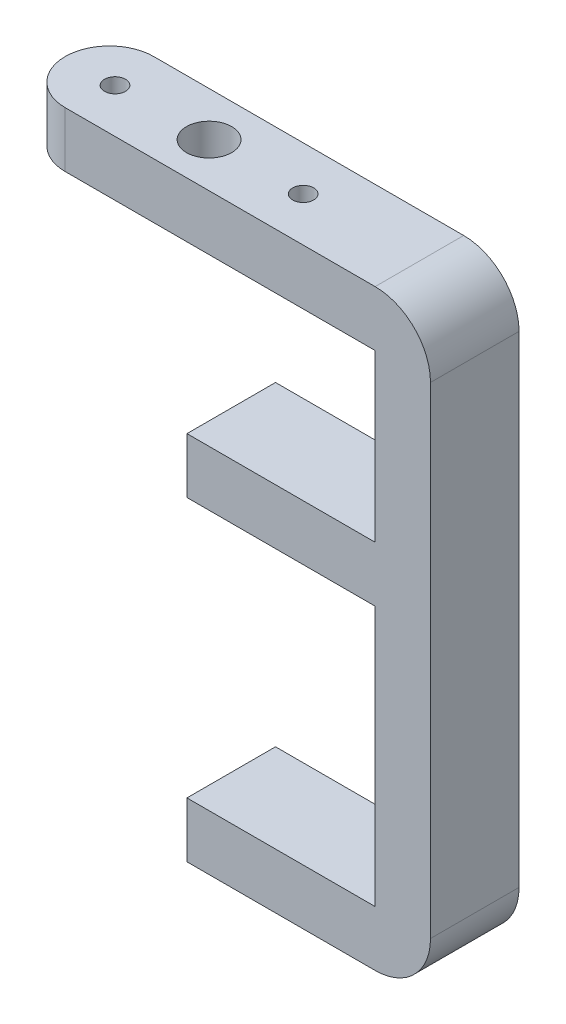
ISO-10303-21;
HEADER;
FILE_DESCRIPTION(('STEP AP214'),'2;1');
FILE_NAME('part.step','',(''),(''),'','','');
FILE_SCHEMA(('AUTOMOTIVE_DESIGN { 1 0 10303 214 1 1 1 1 }'));
ENDSEC;
DATA;
#1=APPLICATION_CONTEXT('core data for automotive mechanical design processes');
#2=APPLICATION_PROTOCOL_DEFINITION('international standard','automotive_design',2000,#1);
#3=PRODUCT_CONTEXT('',#1,'mechanical');
#4=PRODUCT('Part','Part','',(#3));
#5=PRODUCT_RELATED_PRODUCT_CATEGORY('part','',(#4));
#6=PRODUCT_DEFINITION_FORMATION('','',#4);
#7=PRODUCT_DEFINITION_CONTEXT('part definition',#1,'design');
#8=PRODUCT_DEFINITION('design','',#6,#7);
#9=PRODUCT_DEFINITION_SHAPE('','',#8);
#10=(LENGTH_UNIT() NAMED_UNIT(*) SI_UNIT(.MILLI.,.METRE.));
#11=(NAMED_UNIT(*) PLANE_ANGLE_UNIT() SI_UNIT($,.RADIAN.));
#12=(NAMED_UNIT(*) SI_UNIT($,.STERADIAN.) SOLID_ANGLE_UNIT());
#13=UNCERTAINTY_MEASURE_WITH_UNIT(LENGTH_MEASURE(1.E-05),#10,'distance_accuracy_value','');
#14=(GEOMETRIC_REPRESENTATION_CONTEXT(3) GLOBAL_UNCERTAINTY_ASSIGNED_CONTEXT((#13)) GLOBAL_UNIT_ASSIGNED_CONTEXT((#10,
#11,#12)) REPRESENTATION_CONTEXT('',''));
#15=CARTESIAN_POINT('',(0.,0.,0.));
#16=DIRECTION('',(0.,0.,1.));
#17=DIRECTION('',(1.,0.,0.));
#18=AXIS2_PLACEMENT_3D('',#15,#16,#17);
#19=CARTESIAN_POINT('',(53.1915910190782,212.276183768311,-32.0000067636297));
#20=DIRECTION('',(1.,0.,0.));
#21=DIRECTION('',(0.,1.,0.));
#22=AXIS2_PLACEMENT_3D('',#19,#20,#21);
#23=PLANE('',#22);
#24=DIRECTION('',(0.,0.,1.));
#25=VECTOR('',#24,1.);
#26=CARTESIAN_POINT('',(53.1915910190782,172.276183768311,31.9999932363703));
#27=LINE('',#26,#25);
#28=CARTESIAN_POINT('',(53.1915910190782,172.276183768311,-32.0000067636297));
#29=VERTEX_POINT('',#28);
#30=CARTESIAN_POINT('',(53.1915910190782,172.276183768311,31.9999932363703));
#31=VERTEX_POINT('',#30);
#32=EDGE_CURVE('E155',#29,#31,#27,.T.);
#33=ORIENTED_EDGE('',*,*,#32,.F.);
#34=DIRECTION('',(0.,-1.,0.));
#35=VECTOR('',#34,1.);
#36=CARTESIAN_POINT('',(53.1915910190782,212.276183768311,-32.0000067636297));
#37=LINE('',#36,#35);
#38=CARTESIAN_POINT('',(53.1915910190782,52.2761837683105,-32.0000067636297));
#39=VERTEX_POINT('',#38);
#40=EDGE_CURVE('E169',#29,#39,#37,.T.);
#41=ORIENTED_EDGE('',*,*,#40,.T.);
#42=DIRECTION('',(0.,0.,1.));
#43=VECTOR('',#42,1.);
#44=CARTESIAN_POINT('',(53.1915910190782,52.2761837683105,-32.0000067636297));
#45=LINE('',#44,#43);
#46=CARTESIAN_POINT('',(53.1915910190782,52.2761837683105,31.9999932363703));
#47=VERTEX_POINT('',#46);
#48=EDGE_CURVE('E164',#39,#47,#45,.T.);
#49=ORIENTED_EDGE('',*,*,#48,.T.);
#50=DIRECTION('',(0.,-1.,0.));
#51=VECTOR('',#50,1.);
#52=CARTESIAN_POINT('',(53.1915910190782,212.276183768311,31.9999932363703));
#53=LINE('',#52,#51);
#54=EDGE_CURVE('E171',#31,#47,#53,.T.);
#55=ORIENTED_EDGE('',*,*,#54,.F.);
#56=EDGE_LOOP('',(#33,#41,#49,#55));
#57=FACE_BOUND('',#56,.T.);
#58=ADVANCED_FACE('F45',(#57),#23,.F.);
#59=CARTESIAN_POINT('',(-82.8084089809218,52.2761837683105,31.9999932363703));
#60=DIRECTION('',(0.,-1.,0.));
#61=DIRECTION('',(0.,0.,-1.));
#62=AXIS2_PLACEMENT_3D('',#59,#60,#61);
#63=PLANE('',#62);
#64=ORIENTED_EDGE('',*,*,#48,.F.);
#65=DIRECTION('',(-1.,0.,0.));
#66=VECTOR('',#65,1.);
#67=CARTESIAN_POINT('',(-82.8084089809218,52.2761837683105,-32.0000067636297));
#68=LINE('',#67,#66);
#69=CARTESIAN_POINT('',(-82.8084089809218,52.2761837683105,-32.0000067636297));
#70=VERTEX_POINT('',#69);
#71=EDGE_CURVE('E178',#39,#70,#68,.T.);
#72=ORIENTED_EDGE('',*,*,#71,.T.);
#73=DIRECTION('',(0.,0.,-1.));
#74=VECTOR('',#73,1.);
#75=CARTESIAN_POINT('',(-82.8084089809218,52.2761837683105,31.9999932363703));
#76=LINE('',#75,#74);
#77=CARTESIAN_POINT('',(-82.8084089809218,52.2761837683105,31.9999932363703));
#78=VERTEX_POINT('',#77);
#79=EDGE_CURVE('E252',#78,#70,#76,.T.);
#80=ORIENTED_EDGE('',*,*,#79,.F.);
#81=DIRECTION('',(-1.,0.,0.));
#82=VECTOR('',#81,1.);
#83=CARTESIAN_POINT('',(-82.8084089809218,52.2761837683105,31.9999932363703));
#84=LINE('',#83,#82);
#85=EDGE_CURVE('E200',#47,#78,#84,.T.);
#86=ORIENTED_EDGE('',*,*,#85,.F.);
#87=EDGE_LOOP('',(#64,#72,#80,#86));
#88=FACE_BOUND('',#87,.T.);
#89=ADVANCED_FACE('F306',(#88),#63,.F.);
#90=CARTESIAN_POINT('',(-82.8084089809218,-215.723816231689,31.9999932363703));
#91=DIRECTION('',(1.,0.,0.));
#92=DIRECTION('',(0.,0.,-1.));
#93=AXIS2_PLACEMENT_3D('',#90,#91,#92);
#94=PLANE('',#93);
#95=CARTESIAN_POINT('',(-82.8084089809218,-190.874116647392,-0.000475230144837582));
#96=DIRECTION('',(-1.,0.,0.));
#97=DIRECTION('',(0.,0.,1.));
#98=AXIS2_PLACEMENT_3D('',#95,#96,#97);
#99=CIRCLE('',#98,9.6);
#100=CARTESIAN_POINT('',(-82.8084089809218,-190.874116647392,9.59952476985516));
#101=VERTEX_POINT('',#100);
#102=EDGE_CURVE('E381',#101,#101,#99,.T.);
#103=ORIENTED_EDGE('',*,*,#102,.F.);
#104=EDGE_LOOP('',(#103));
#105=FACE_BOUND('',#104,.T.);
#106=DIRECTION('',(0.,-1.,0.));
#107=VECTOR('',#106,1.);
#108=CARTESIAN_POINT('',(-82.8084089809218,-215.723816231689,-32.0000067636297));
#109=LINE('',#108,#107);
#110=CARTESIAN_POINT('',(-82.8084089809218,-175.723816231689,-32.0000067636297));
#111=VERTEX_POINT('',#110);
#112=CARTESIAN_POINT('',(-82.8084089809218,-215.723816231689,-32.0000067636297));
#113=VERTEX_POINT('',#112);
#114=EDGE_CURVE('E180',#111,#113,#109,.T.);
#115=ORIENTED_EDGE('',*,*,#114,.T.);
#116=DIRECTION('',(0.,0.,-1.));
#117=VECTOR('',#116,1.);
#118=CARTESIAN_POINT('',(-82.8084089809218,-215.723816231689,31.9999932363703));
#119=LINE('',#118,#117);
#120=CARTESIAN_POINT('',(-82.8084089809218,-215.723816231689,31.9999932363703));
#121=VERTEX_POINT('',#120);
#122=EDGE_CURVE('E247',#121,#113,#119,.T.);
#123=ORIENTED_EDGE('',*,*,#122,.F.);
#124=DIRECTION('',(0.,-1.,0.));
#125=VECTOR('',#124,1.);
#126=CARTESIAN_POINT('',(-82.8084089809218,-215.723816231689,31.9999932363703));
#127=LINE('',#126,#125);
#128=CARTESIAN_POINT('',(-82.8084089809218,-175.723816231689,31.9999932363703));
#129=VERTEX_POINT('',#128);
#130=EDGE_CURVE('E207',#129,#121,#127,.T.);
#131=ORIENTED_EDGE('',*,*,#130,.F.);
#132=DIRECTION('',(0.,0.,-1.));
#133=VECTOR('',#132,1.);
#134=CARTESIAN_POINT('',(-82.8084089809218,-175.723816231689,31.9999932363703));
#135=LINE('',#134,#133);
#136=EDGE_CURVE('E232',#129,#111,#135,.T.);
#137=ORIENTED_EDGE('',*,*,#136,.T.);
#138=EDGE_LOOP('',(#115,#123,#131,#137));
#139=FACE_BOUND('',#138,.T.);
#140=ADVANCED_FACE('F308',(#105,#139),#94,.F.);
#141=CARTESIAN_POINT('',(93.1915910190783,-215.723816231689,31.9999932363703));
#142=DIRECTION('',(0.,1.,0.));
#143=DIRECTION('',(-1.,0.,0.));
#144=AXIS2_PLACEMENT_3D('',#141,#142,#143);
#145=PLANE('',#144);
#146=DIRECTION('',(1.,0.,0.));
#147=VECTOR('',#146,1.);
#148=CARTESIAN_POINT('',(93.1915910190783,-215.723816231689,-32.0000067636297));
#149=LINE('',#148,#147);
#150=CARTESIAN_POINT('',(53.1915910190783,-215.723816231689,-32.0000067636297));
#151=VERTEX_POINT('',#150);
#152=EDGE_CURVE('E185',#113,#151,#149,.T.);
#153=ORIENTED_EDGE('',*,*,#152,.T.);
#154=DIRECTION('',(0.,0.,-1.));
#155=VECTOR('',#154,1.);
#156=CARTESIAN_POINT('',(53.1915910190783,-215.723816231689,31.9999932363703));
#157=LINE('',#156,#155);
#158=CARTESIAN_POINT('',(53.1915910190783,-215.723816231689,31.9999932363703));
#159=VERTEX_POINT('',#158);
#160=EDGE_CURVE('E630',#151,#159,#157,.F.);
#161=ORIENTED_EDGE('',*,*,#160,.T.);
#162=DIRECTION('',(1.,0.,0.));
#163=VECTOR('',#162,1.);
#164=CARTESIAN_POINT('',(93.1915910190783,-215.723816231689,31.9999932363703));
#165=LINE('',#164,#163);
#166=EDGE_CURVE('E211',#121,#159,#165,.T.);
#167=ORIENTED_EDGE('',*,*,#166,.F.);
#168=ORIENTED_EDGE('',*,*,#122,.T.);
#169=EDGE_LOOP('',(#153,#161,#167,#168));
#170=FACE_BOUND('',#169,.T.);
#171=ADVANCED_FACE('F314',(#170),#145,.F.);
#172=CARTESIAN_POINT('',(93.1915910190782,52.2761837683105,31.9999932363703));
#173=DIRECTION('',(-1.,0.,0.));
#174=DIRECTION('',(0.,-1.,0.));
#175=AXIS2_PLACEMENT_3D('',#172,#173,#174);
#176=PLANE('',#175);
#177=DIRECTION('',(0.,1.,0.));
#178=VECTOR('',#177,1.);
#179=CARTESIAN_POINT('',(93.1915910190782,52.2761837683105,31.9999932363703));
#180=LINE('',#179,#178);
#181=CARTESIAN_POINT('',(93.1915910190783,-175.723816231689,31.9999932363703));
#182=VERTEX_POINT('',#181);
#183=CARTESIAN_POINT('',(93.1915910190782,172.276183768311,31.9999932363703));
#184=VERTEX_POINT('',#183);
#185=EDGE_CURVE('E216',#182,#184,#180,.T.);
#186=ORIENTED_EDGE('',*,*,#185,.F.);
#187=DIRECTION('',(0.,0.,-1.));
#188=VECTOR('',#187,1.);
#189=CARTESIAN_POINT('',(93.1915910190783,-175.723816231689,31.9999932363703));
#190=LINE('',#189,#188);
#191=CARTESIAN_POINT('',(93.1915910190783,-175.723816231689,-32.0000067636297));
#192=VERTEX_POINT('',#191);
#193=EDGE_CURVE('E639',#182,#192,#190,.T.);
#194=ORIENTED_EDGE('',*,*,#193,.T.);
#195=DIRECTION('',(0.,1.,0.));
#196=VECTOR('',#195,1.);
#197=CARTESIAN_POINT('',(93.1915910190782,52.2761837683105,-32.0000067636297));
#198=LINE('',#197,#196);
#199=CARTESIAN_POINT('',(93.1915910190782,172.276183768311,-32.0000067636297));
#200=VERTEX_POINT('',#199);
#201=EDGE_CURVE('E237',#192,#200,#198,.T.);
#202=ORIENTED_EDGE('',*,*,#201,.T.);
#203=DIRECTION('',(0.,0.,-1.));
#204=VECTOR('',#203,1.);
#205=CARTESIAN_POINT('',(93.1915910190782,172.276183768311,31.9999932363703));
#206=LINE('',#205,#204);
#207=EDGE_CURVE('E251',#200,#184,#206,.F.);
#208=ORIENTED_EDGE('',*,*,#207,.T.);
#209=EDGE_LOOP('',(#186,#194,#202,#208));
#210=FACE_BOUND('',#209,.T.);
#211=ADVANCED_FACE('F321',(#210),#176,.F.);
#212=CARTESIAN_POINT('',(-82.8084089809218,12.2761837683105,31.9999932363703));
#213=DIRECTION('',(1.,0.,0.));
#214=DIRECTION('',(0.,0.,-1.));
#215=AXIS2_PLACEMENT_3D('',#212,#213,#214);
#216=PLANE('',#215);
#217=CARTESIAN_POINT('',(-82.8084089809218,25.0256764113852,-0.000498084831965641));
#218=DIRECTION('',(-1.,0.,0.));
#219=DIRECTION('',(0.,0.,1.));
#220=AXIS2_PLACEMENT_3D('',#217,#218,#219);
#221=CIRCLE('',#220,9.6);
#222=CARTESIAN_POINT('',(-82.8084089809218,25.0256764113852,9.59950191516803));
#223=VERTEX_POINT('',#222);
#224=EDGE_CURVE('E373',#223,#223,#221,.T.);
#225=ORIENTED_EDGE('',*,*,#224,.F.);
#226=EDGE_LOOP('',(#225));
#227=FACE_BOUND('',#226,.T.);
#228=DIRECTION('',(0.,-1.,0.));
#229=VECTOR('',#228,1.);
#230=CARTESIAN_POINT('',(-82.8084089809218,12.2761837683105,-32.0000067636297));
#231=LINE('',#230,#229);
#232=CARTESIAN_POINT('',(-82.8084089809218,12.2761837683105,-32.0000067636297));
#233=VERTEX_POINT('',#232);
#234=EDGE_CURVE('E243',#70,#233,#231,.T.);
#235=ORIENTED_EDGE('',*,*,#234,.T.);
#236=DIRECTION('',(0.,0.,-1.));
#237=VECTOR('',#236,1.);
#238=CARTESIAN_POINT('',(-82.8084089809218,12.2761837683105,31.9999932363703));
#239=LINE('',#238,#237);
#240=CARTESIAN_POINT('',(-82.8084089809218,12.2761837683105,31.9999932363703));
#241=VERTEX_POINT('',#240);
#242=EDGE_CURVE('E256',#241,#233,#239,.T.);
#243=ORIENTED_EDGE('',*,*,#242,.F.);
#244=DIRECTION('',(0.,-1.,0.));
#245=VECTOR('',#244,1.);
#246=CARTESIAN_POINT('',(-82.8084089809218,12.2761837683105,31.9999932363703));
#247=LINE('',#246,#245);
#248=EDGE_CURVE('E221',#78,#241,#247,.T.);
#249=ORIENTED_EDGE('',*,*,#248,.F.);
#250=ORIENTED_EDGE('',*,*,#79,.T.);
#251=EDGE_LOOP('',(#235,#243,#249,#250));
#252=FACE_BOUND('',#251,.T.);
#253=ADVANCED_FACE('F283',(#227,#252),#216,.F.);
#254=CARTESIAN_POINT('',(53.1915910190782,12.2761837683106,31.9999932363703));
#255=DIRECTION('',(0.,1.,0.));
#256=DIRECTION('',(-1.,0.,0.));
#257=AXIS2_PLACEMENT_3D('',#254,#255,#256);
#258=PLANE('',#257);
#259=DIRECTION('',(1.,0.,0.));
#260=VECTOR('',#259,1.);
#261=CARTESIAN_POINT('',(53.1915910190782,12.2761837683106,-32.0000067636297));
#262=LINE('',#261,#260);
#263=CARTESIAN_POINT('',(53.1915910190782,12.2761837683106,-32.0000067636297));
#264=VERTEX_POINT('',#263);
#265=EDGE_CURVE('E275',#233,#264,#262,.T.);
#266=ORIENTED_EDGE('',*,*,#265,.T.);
#267=DIRECTION('',(0.,0.,-1.));
#268=VECTOR('',#267,1.);
#269=CARTESIAN_POINT('',(53.1915910190782,12.2761837683106,31.9999932363703));
#270=LINE('',#269,#268);
#271=CARTESIAN_POINT('',(53.1915910190782,12.2761837683106,31.9999932363703));
#272=VERTEX_POINT('',#271);
#273=EDGE_CURVE('E260',#272,#264,#270,.T.);
#274=ORIENTED_EDGE('',*,*,#273,.F.);
#275=DIRECTION('',(1.,0.,0.));
#276=VECTOR('',#275,1.);
#277=CARTESIAN_POINT('',(53.1915910190782,12.2761837683106,31.9999932363703));
#278=LINE('',#277,#276);
#279=EDGE_CURVE('E224',#241,#272,#278,.T.);
#280=ORIENTED_EDGE('',*,*,#279,.F.);
#281=ORIENTED_EDGE('',*,*,#242,.T.);
#282=EDGE_LOOP('',(#266,#274,#280,#281));
#283=FACE_BOUND('',#282,.T.);
#284=ADVANCED_FACE('F287',(#283),#258,.F.);
#285=CARTESIAN_POINT('',(53.1915910190782,-175.723816231689,31.9999932363703));
#286=DIRECTION('',(1.,0.,0.));
#287=DIRECTION('',(0.,0.,-1.));
#288=AXIS2_PLACEMENT_3D('',#285,#286,#287);
#289=PLANE('',#288);
#290=DIRECTION('',(0.,-1.,0.));
#291=VECTOR('',#290,1.);
#292=CARTESIAN_POINT('',(53.1915910190782,-175.723816231689,-32.0000067636297));
#293=LINE('',#292,#291);
#294=CARTESIAN_POINT('',(53.1915910190782,-175.723816231689,-32.0000067636297));
#295=VERTEX_POINT('',#294);
#296=EDGE_CURVE('E273',#264,#295,#293,.T.);
#297=ORIENTED_EDGE('',*,*,#296,.T.);
#298=DIRECTION('',(0.,0.,-1.));
#299=VECTOR('',#298,1.);
#300=CARTESIAN_POINT('',(53.1915910190782,-175.723816231689,31.9999932363703));
#301=LINE('',#300,#299);
#302=CARTESIAN_POINT('',(53.1915910190782,-175.723816231689,31.9999932363703));
#303=VERTEX_POINT('',#302);
#304=EDGE_CURVE('E264',#303,#295,#301,.T.);
#305=ORIENTED_EDGE('',*,*,#304,.F.);
#306=DIRECTION('',(0.,-1.,0.));
#307=VECTOR('',#306,1.);
#308=CARTESIAN_POINT('',(53.1915910190782,-175.723816231689,31.9999932363703));
#309=LINE('',#308,#307);
#310=EDGE_CURVE('E227',#272,#303,#309,.T.);
#311=ORIENTED_EDGE('',*,*,#310,.F.);
#312=ORIENTED_EDGE('',*,*,#273,.T.);
#313=EDGE_LOOP('',(#297,#305,#311,#312));
#314=FACE_BOUND('',#313,.T.);
#315=ADVANCED_FACE('F293',(#314),#289,.F.);
#316=CARTESIAN_POINT('',(-82.8084089809218,-175.723816231689,31.9999932363703));
#317=DIRECTION('',(0.,-1.,0.));
#318=DIRECTION('',(0.,0.,-1.));
#319=AXIS2_PLACEMENT_3D('',#316,#317,#318);
#320=PLANE('',#319);
#321=DIRECTION('',(-1.,0.,0.));
#322=VECTOR('',#321,1.);
#323=CARTESIAN_POINT('',(-82.8084089809218,-175.723816231689,-32.0000067636297));
#324=LINE('',#323,#322);
#325=EDGE_CURVE('E212',#295,#111,#324,.T.);
#326=ORIENTED_EDGE('',*,*,#325,.T.);
#327=ORIENTED_EDGE('',*,*,#136,.F.);
#328=DIRECTION('',(-1.,0.,0.));
#329=VECTOR('',#328,1.);
#330=CARTESIAN_POINT('',(-82.8084089809218,-175.723816231689,31.9999932363703));
#331=LINE('',#330,#329);
#332=EDGE_CURVE('E230',#303,#129,#331,.T.);
#333=ORIENTED_EDGE('',*,*,#332,.F.);
#334=ORIENTED_EDGE('',*,*,#304,.T.);
#335=EDGE_LOOP('',(#326,#327,#333,#334));
#336=FACE_BOUND('',#335,.T.);
#337=ADVANCED_FACE('F297',(#336),#320,.F.);
#338=CARTESIAN_POINT('',(-82.8084089809218,-175.723816231689,31.9999932363703));
#339=DIRECTION('',(0.,0.,-1.));
#340=DIRECTION('',(-1.,0.,0.));
#341=AXIS2_PLACEMENT_3D('',#338,#339,#340);
#342=PLANE('',#341);
#343=DIRECTION('',(1.,0.,0.));
#344=VECTOR('',#343,1.);
#345=CARTESIAN_POINT('',(93.1915910190782,212.276183768311,31.9999932363703));
#346=LINE('',#345,#344);
#347=CARTESIAN_POINT('',(-170.808408980922,212.276183768311,31.9999932363703));
#348=VERTEX_POINT('',#347);
#349=CARTESIAN_POINT('',(53.1915910190782,212.276183768311,31.9999932363703));
#350=VERTEX_POINT('',#349);
#351=EDGE_CURVE('E187',#348,#350,#346,.T.);
#352=ORIENTED_EDGE('',*,*,#351,.F.);
#353=DIRECTION('',(0.,1.,0.));
#354=VECTOR('',#353,1.);
#355=CARTESIAN_POINT('',(-170.808408980922,-175.723816231689,31.9999932363703));
#356=LINE('',#355,#354);
#357=CARTESIAN_POINT('',(-170.808408980922,172.276183768311,31.9999932363703));
#358=VERTEX_POINT('',#357);
#359=EDGE_CURVE('E11',#348,#358,#356,.F.);
#360=ORIENTED_EDGE('',*,*,#359,.T.);
#361=DIRECTION('',(1.,0.,0.));
#362=VECTOR('',#361,1.);
#363=CARTESIAN_POINT('',(-202.808408980922,172.276183768311,31.9999932363703));
#364=LINE('',#363,#362);
#365=EDGE_CURVE('E165',#358,#31,#364,.T.);
#366=ORIENTED_EDGE('',*,*,#365,.T.);
#367=ORIENTED_EDGE('',*,*,#54,.T.);
#368=ORIENTED_EDGE('',*,*,#85,.T.);
#369=ORIENTED_EDGE('',*,*,#248,.T.);
#370=ORIENTED_EDGE('',*,*,#279,.T.);
#371=ORIENTED_EDGE('',*,*,#310,.T.);
#372=ORIENTED_EDGE('',*,*,#332,.T.);
#373=ORIENTED_EDGE('',*,*,#130,.T.);
#374=ORIENTED_EDGE('',*,*,#166,.T.);
#375=CARTESIAN_POINT('',(53.1915910190783,-175.723816231689,31.9999932363703));
#376=DIRECTION('',(0.,0.,-1.));
#377=DIRECTION('',(-1.,0.,0.));
#378=AXIS2_PLACEMENT_3D('',#375,#376,#377);
#379=CIRCLE('',#378,40.);
#380=EDGE_CURVE('E623',#159,#182,#379,.F.);
#381=ORIENTED_EDGE('',*,*,#380,.T.);
#382=ORIENTED_EDGE('',*,*,#185,.T.);
#383=CARTESIAN_POINT('',(53.1915910190782,172.276183768311,31.9999932363703));
#384=DIRECTION('',(0.,0.,-1.));
#385=DIRECTION('',(-1.,0.,0.));
#386=AXIS2_PLACEMENT_3D('',#383,#384,#385);
#387=CIRCLE('',#386,40.);
#388=EDGE_CURVE('E626',#184,#350,#387,.F.);
#389=ORIENTED_EDGE('',*,*,#388,.T.);
#390=EDGE_LOOP('',(#352,#360,#366,#367,#368,#369,#370,#371,#372,#373,#374,#381,#382,#389));
#391=FACE_BOUND('',#390,.T.);
#392=ADVANCED_FACE('F301',(#391),#342,.F.);
#393=CARTESIAN_POINT('',(-82.8084089809218,-175.723816231689,-32.0000067636297));
#394=DIRECTION('',(0.,0.,-1.));
#395=DIRECTION('',(-1.,0.,0.));
#396=AXIS2_PLACEMENT_3D('',#393,#394,#395);
#397=PLANE('',#396);
#398=DIRECTION('',(1.,0.,0.));
#399=VECTOR('',#398,1.);
#400=CARTESIAN_POINT('',(-202.808408980922,172.276183768311,-32.0000067636297));
#401=LINE('',#400,#399);
#402=CARTESIAN_POINT('',(-170.808408980922,172.276183768311,-32.0000067636297));
#403=VERTEX_POINT('',#402);
#404=EDGE_CURVE('E151',#403,#29,#401,.T.);
#405=ORIENTED_EDGE('',*,*,#404,.F.);
#406=DIRECTION('',(0.,-1.,0.));
#407=VECTOR('',#406,1.);
#408=CARTESIAN_POINT('',(-170.808408980922,212.276183768311,-32.0000067636297));
#409=LINE('',#408,#407);
#410=CARTESIAN_POINT('',(-170.808408980922,212.276183768311,-32.0000067636296));
#411=VERTEX_POINT('',#410);
#412=EDGE_CURVE('E351',#403,#411,#409,.F.);
#413=ORIENTED_EDGE('',*,*,#412,.T.);
#414=DIRECTION('',(-1.,0.,0.));
#415=VECTOR('',#414,1.);
#416=CARTESIAN_POINT('',(93.1915910190782,212.276183768311,-32.0000067636297));
#417=LINE('',#416,#415);
#418=CARTESIAN_POINT('',(53.1915910190782,212.276183768311,-32.0000067636297));
#419=VERTEX_POINT('',#418);
#420=EDGE_CURVE('E199',#419,#411,#417,.T.);
#421=ORIENTED_EDGE('',*,*,#420,.F.);
#422=CARTESIAN_POINT('',(53.1915910190782,172.276183768311,-32.0000067636297));
#423=DIRECTION('',(0.,0.,-1.));
#424=DIRECTION('',(-1.,0.,0.));
#425=AXIS2_PLACEMENT_3D('',#422,#423,#424);
#426=CIRCLE('',#425,40.);
#427=EDGE_CURVE('E636',#419,#200,#426,.T.);
#428=ORIENTED_EDGE('',*,*,#427,.T.);
#429=ORIENTED_EDGE('',*,*,#201,.F.);
#430=CARTESIAN_POINT('',(53.1915910190783,-175.723816231689,-32.0000067636297));
#431=DIRECTION('',(0.,0.,-1.));
#432=DIRECTION('',(-1.,0.,0.));
#433=AXIS2_PLACEMENT_3D('',#430,#431,#432);
#434=CIRCLE('',#433,40.);
#435=EDGE_CURVE('E633',#192,#151,#434,.T.);
#436=ORIENTED_EDGE('',*,*,#435,.T.);
#437=ORIENTED_EDGE('',*,*,#152,.F.);
#438=ORIENTED_EDGE('',*,*,#114,.F.);
#439=ORIENTED_EDGE('',*,*,#325,.F.);
#440=ORIENTED_EDGE('',*,*,#296,.F.);
#441=ORIENTED_EDGE('',*,*,#265,.F.);
#442=ORIENTED_EDGE('',*,*,#234,.F.);
#443=ORIENTED_EDGE('',*,*,#71,.F.);
#444=ORIENTED_EDGE('',*,*,#40,.F.);
#445=EDGE_LOOP('',(#405,#413,#421,#428,#429,#436,#437,#438,#439,#440,#441,#442,#443,#444));
#446=FACE_BOUND('',#445,.T.);
#447=ADVANCED_FACE('F176',(#446),#397,.T.);
#448=CARTESIAN_POINT('',(-82.8084089809217,212.276183768311,-6.76362969410784E-06));
#449=DIRECTION('',(0.,-1.,0.));
#450=DIRECTION('',(0.,0.,-1.));
#451=AXIS2_PLACEMENT_3D('',#448,#449,#450);
#452=PLANE('',#451);
#453=CARTESIAN_POINT('',(-30.8084089809218,212.276183768311,-6.76362969704699E-06));
#454=DIRECTION('',(0.,1.,0.));
#455=DIRECTION('',(0.,0.,1.));
#456=AXIS2_PLACEMENT_3D('',#453,#454,#455);
#457=CIRCLE('',#456,7.6);
#458=CARTESIAN_POINT('',(-30.8084089809218,212.276183768311,7.5999932363703));
#459=VERTEX_POINT('',#458);
#460=EDGE_CURVE('E393',#459,#459,#457,.T.);
#461=ORIENTED_EDGE('',*,*,#460,.F.);
#462=EDGE_LOOP('',(#461));
#463=FACE_BOUND('',#462,.T.);
#464=CARTESIAN_POINT('',(-166.808408980922,212.276183768311,-6.76362967745264E-06));
#465=DIRECTION('',(0.,1.,0.));
#466=DIRECTION('',(0.,0.,1.));
#467=AXIS2_PLACEMENT_3D('',#464,#465,#466);
#468=CIRCLE('',#467,7.59999999999999);
#469=CARTESIAN_POINT('',(-166.808408980922,212.276183768311,7.59999323637032));
#470=VERTEX_POINT('',#469);
#471=EDGE_CURVE('E388',#470,#470,#468,.T.);
#472=ORIENTED_EDGE('',*,*,#471,.F.);
#473=EDGE_LOOP('',(#472));
#474=FACE_BOUND('',#473,.T.);
#475=CARTESIAN_POINT('',(-98.8084089809218,212.276183768311,-6.76362969410784E-06));
#476=DIRECTION('',(0.,1.,0.));
#477=DIRECTION('',(0.,0.,1.));
#478=AXIS2_PLACEMENT_3D('',#475,#476,#477);
#479=CIRCLE('',#478,16.32);
#480=CARTESIAN_POINT('',(-98.8084089809218,212.276183768311,16.3199932363703));
#481=VERTEX_POINT('',#480);
#482=EDGE_CURVE('E368',#481,#481,#479,.T.);
#483=ORIENTED_EDGE('',*,*,#482,.F.);
#484=EDGE_LOOP('',(#483));
#485=FACE_BOUND('',#484,.T.);
#486=ORIENTED_EDGE('',*,*,#420,.T.);
#487=CARTESIAN_POINT('',(-170.808408980922,212.276183768311,-6.76362969410784E-06));
#488=DIRECTION('',(0.,-1.,0.));
#489=DIRECTION('',(0.,0.,-1.));
#490=AXIS2_PLACEMENT_3D('',#487,#488,#489);
#491=CIRCLE('',#490,32.);
#492=CARTESIAN_POINT('',(-202.808408980922,212.276183768311,-6.76362969410784E-06));
#493=VERTEX_POINT('',#492);
#494=EDGE_CURVE('E55',#411,#493,#491,.F.);
#495=ORIENTED_EDGE('',*,*,#494,.T.);
#496=CARTESIAN_POINT('',(-170.808408980922,212.276183768311,-6.76362969410784E-06));
#497=DIRECTION('',(0.,-1.,0.));
#498=DIRECTION('',(0.,0.,-1.));
#499=AXIS2_PLACEMENT_3D('',#496,#497,#498);
#500=CIRCLE('',#499,32.);
#501=EDGE_CURVE('E66',#493,#348,#500,.F.);
#502=ORIENTED_EDGE('',*,*,#501,.T.);
#503=ORIENTED_EDGE('',*,*,#351,.T.);
#504=DIRECTION('',(0.,0.,-1.));
#505=VECTOR('',#504,1.);
#506=CARTESIAN_POINT('',(53.1915910190782,212.276183768311,-6.76362969410784E-06));
#507=LINE('',#506,#505);
#508=EDGE_CURVE('E362',#350,#419,#507,.T.);
#509=ORIENTED_EDGE('',*,*,#508,.T.);
#510=EDGE_LOOP('',(#486,#495,#502,#503,#509));
#511=FACE_BOUND('',#510,.T.);
#512=ADVANCED_FACE('F360',(#463,#474,#485,#511),#452,.F.);
#513=CARTESIAN_POINT('',(-202.808408980922,172.276183768311,31.9999932363703));
#514=DIRECTION('',(0.,1.,0.));
#515=DIRECTION('',(-1.,0.,0.));
#516=AXIS2_PLACEMENT_3D('',#513,#514,#515);
#517=PLANE('',#516);
#518=CARTESIAN_POINT('',(-30.8084089809218,172.276183768311,-6.76362969704699E-06));
#519=DIRECTION('',(0.,1.,0.));
#520=DIRECTION('',(-1.,0.,0.));
#521=AXIS2_PLACEMENT_3D('',#518,#519,#520);
#522=CIRCLE('',#521,7.6);
#523=CARTESIAN_POINT('',(-38.4084089809218,172.276183768311,-6.76362969704699E-06));
#524=VERTEX_POINT('',#523);
#525=EDGE_CURVE('E49',#524,#524,#522,.T.);
#526=ORIENTED_EDGE('',*,*,#525,.T.);
#527=EDGE_LOOP('',(#526));
#528=FACE_BOUND('',#527,.T.);
#529=CARTESIAN_POINT('',(-166.808408980922,172.276183768311,-6.76362967745264E-06));
#530=DIRECTION('',(0.,1.,0.));
#531=DIRECTION('',(-1.,0.,0.));
#532=AXIS2_PLACEMENT_3D('',#529,#530,#531);
#533=CIRCLE('',#532,7.59999999999999);
#534=CARTESIAN_POINT('',(-174.408408980922,172.276183768311,-6.76362967745264E-06));
#535=VERTEX_POINT('',#534);
#536=EDGE_CURVE('E392',#535,#535,#533,.T.);
#537=ORIENTED_EDGE('',*,*,#536,.T.);
#538=EDGE_LOOP('',(#537));
#539=FACE_BOUND('',#538,.T.);
#540=CARTESIAN_POINT('',(-98.8084089809218,172.276183768311,-6.76362969410784E-06));
#541=DIRECTION('',(0.,1.,0.));
#542=DIRECTION('',(-1.,0.,0.));
#543=AXIS2_PLACEMENT_3D('',#540,#541,#542);
#544=CIRCLE('',#543,16.32);
#545=CARTESIAN_POINT('',(-115.128408980922,172.276183768311,-6.76362969410784E-06));
#546=VERTEX_POINT('',#545);
#547=EDGE_CURVE('E173',#546,#546,#544,.T.);
#548=ORIENTED_EDGE('',*,*,#547,.T.);
#549=EDGE_LOOP('',(#548));
#550=FACE_BOUND('',#549,.T.);
#551=CARTESIAN_POINT('',(-170.808408980922,172.276183768311,-6.76362969410784E-06));
#552=DIRECTION('',(0.,1.,0.));
#553=DIRECTION('',(-1.,0.,0.));
#554=AXIS2_PLACEMENT_3D('',#551,#552,#553);
#555=CIRCLE('',#554,32.);
#556=CARTESIAN_POINT('',(-202.808408980922,172.276183768311,-6.76362969410784E-06));
#557=VERTEX_POINT('',#556);
#558=EDGE_CURVE('E618',#358,#557,#555,.F.);
#559=ORIENTED_EDGE('',*,*,#558,.T.);
#560=CARTESIAN_POINT('',(-170.808408980922,172.276183768311,-6.76362969410784E-06));
#561=DIRECTION('',(0.,1.,0.));
#562=DIRECTION('',(-1.,0.,0.));
#563=AXIS2_PLACEMENT_3D('',#560,#561,#562);
#564=CIRCLE('',#563,32.);
#565=EDGE_CURVE('E158',#557,#403,#564,.F.);
#566=ORIENTED_EDGE('',*,*,#565,.T.);
#567=ORIENTED_EDGE('',*,*,#404,.T.);
#568=ORIENTED_EDGE('',*,*,#32,.T.);
#569=ORIENTED_EDGE('',*,*,#365,.F.);
#570=EDGE_LOOP('',(#559,#566,#567,#568,#569));
#571=FACE_BOUND('',#570,.T.);
#572=ADVANCED_FACE('F153',(#528,#539,#550,#571),#517,.F.);
#573=CARTESIAN_POINT('',(-98.8084089809218,92.2761837683105,-6.76362969410784E-06));
#574=DIRECTION('',(0.,1.,0.));
#575=DIRECTION('',(0.,0.,1.));
#576=AXIS2_PLACEMENT_3D('',#573,#574,#575);
#577=CYLINDRICAL_SURFACE('',#576,16.32);
#578=ORIENTED_EDGE('',*,*,#482,.T.);
#579=EDGE_LOOP('',(#578));
#580=FACE_BOUND('',#579,.T.);
#581=ORIENTED_EDGE('',*,*,#547,.F.);
#582=EDGE_LOOP('',(#581));
#583=FACE_BOUND('',#582,.T.);
#584=ADVANCED_FACE('F332',(#580,#583),#577,.F.);
#585=CARTESIAN_POINT('',(53.1915910190783,-175.723816231689,31.9999932363703));
#586=DIRECTION('',(0.,0.,-1.));
#587=DIRECTION('',(-1.,0.,0.));
#588=AXIS2_PLACEMENT_3D('',#585,#586,#587);
#589=CYLINDRICAL_SURFACE('',#588,40.);
#590=ORIENTED_EDGE('',*,*,#380,.F.);
#591=ORIENTED_EDGE('',*,*,#160,.F.);
#592=ORIENTED_EDGE('',*,*,#435,.F.);
#593=ORIENTED_EDGE('',*,*,#193,.F.);
#594=EDGE_LOOP('',(#590,#591,#592,#593));
#595=FACE_BOUND('',#594,.T.);
#596=ADVANCED_FACE('F328',(#595),#589,.T.);
#597=CARTESIAN_POINT('',(53.1915910190782,172.276183768311,-6.76362969410784E-06));
#598=DIRECTION('',(0.,0.,-1.));
#599=DIRECTION('',(-1.,0.,0.));
#600=AXIS2_PLACEMENT_3D('',#597,#598,#599);
#601=CYLINDRICAL_SURFACE('',#600,40.);
#602=ORIENTED_EDGE('',*,*,#388,.F.);
#603=ORIENTED_EDGE('',*,*,#207,.F.);
#604=ORIENTED_EDGE('',*,*,#427,.F.);
#605=ORIENTED_EDGE('',*,*,#508,.F.);
#606=EDGE_LOOP('',(#602,#603,#604,#605));
#607=FACE_BOUND('',#606,.T.);
#608=ADVANCED_FACE('F331',(#607),#601,.T.);
#609=CARTESIAN_POINT('',(-18.8084089809218,25.0256764113852,-0.000498084831965641));
#610=DIRECTION('',(-1.,0.,0.));
#611=DIRECTION('',(0.,0.,1.));
#612=AXIS2_PLACEMENT_3D('',#609,#610,#611);
#613=CYLINDRICAL_SURFACE('',#612,9.6);
#614=CARTESIAN_POINT('',(-18.8084089809218,25.0256764113852,-0.000498084831965641));
#615=DIRECTION('',(-1.,0.,0.));
#616=DIRECTION('',(0.,0.,1.));
#617=AXIS2_PLACEMENT_3D('',#614,#615,#616);
#618=CIRCLE('',#617,9.6);
#619=CARTESIAN_POINT('',(-18.8084089809218,25.0256764113852,9.59950191516803));
#620=VERTEX_POINT('',#619);
#621=EDGE_CURVE('E372',#620,#620,#618,.T.);
#622=ORIENTED_EDGE('',*,*,#621,.F.);
#623=EDGE_LOOP('',(#622));
#624=FACE_BOUND('',#623,.T.);
#625=ORIENTED_EDGE('',*,*,#224,.T.);
#626=EDGE_LOOP('',(#625));
#627=FACE_BOUND('',#626,.T.);
#628=ADVANCED_FACE('F335',(#624,#627),#613,.F.);
#629=CARTESIAN_POINT('',(-18.8084089809218,25.0256764113852,-0.000498084831965641));
#630=DIRECTION('',(-1.,0.,0.));
#631=DIRECTION('',(0.,0.,1.));
#632=AXIS2_PLACEMENT_3D('',#629,#630,#631);
#633=PLANE('',#632);
#634=ORIENTED_EDGE('',*,*,#621,.T.);
#635=EDGE_LOOP('',(#634));
#636=FACE_BOUND('',#635,.T.);
#637=ADVANCED_FACE('F415',(#636),#633,.T.);
#638=CARTESIAN_POINT('',(-18.8084089809218,-190.874116647392,-0.000475230144837582));
#639=DIRECTION('',(-1.,0.,0.));
#640=DIRECTION('',(0.,0.,1.));
#641=AXIS2_PLACEMENT_3D('',#638,#639,#640);
#642=CYLINDRICAL_SURFACE('',#641,9.6);
#643=CARTESIAN_POINT('',(-18.8084089809218,-190.874116647392,-0.000475230144837582));
#644=DIRECTION('',(-1.,0.,0.));
#645=DIRECTION('',(0.,0.,1.));
#646=AXIS2_PLACEMENT_3D('',#643,#644,#645);
#647=CIRCLE('',#646,9.6);
#648=CARTESIAN_POINT('',(-18.8084089809218,-190.874116647392,9.59952476985516));
#649=VERTEX_POINT('',#648);
#650=EDGE_CURVE('E377',#649,#649,#647,.T.);
#651=ORIENTED_EDGE('',*,*,#650,.F.);
#652=EDGE_LOOP('',(#651));
#653=FACE_BOUND('',#652,.T.);
#654=ORIENTED_EDGE('',*,*,#102,.T.);
#655=EDGE_LOOP('',(#654));
#656=FACE_BOUND('',#655,.T.);
#657=ADVANCED_FACE('F411',(#653,#656),#642,.F.);
#658=CARTESIAN_POINT('',(-18.8084089809218,-190.874116647392,-0.000475230144837582));
#659=DIRECTION('',(-1.,0.,0.));
#660=DIRECTION('',(0.,0.,1.));
#661=AXIS2_PLACEMENT_3D('',#658,#659,#660);
#662=PLANE('',#661);
#663=ORIENTED_EDGE('',*,*,#650,.T.);
#664=EDGE_LOOP('',(#663));
#665=FACE_BOUND('',#664,.T.);
#666=ADVANCED_FACE('F348',(#665),#662,.T.);
#667=CARTESIAN_POINT('',(-170.808408980922,-175.723816231689,-6.76362969410784E-06));
#668=DIRECTION('',(0.,1.,0.));
#669=DIRECTION('',(0.,0.,1.));
#670=AXIS2_PLACEMENT_3D('',#667,#668,#669);
#671=CYLINDRICAL_SURFACE('',#670,32.);
#672=ORIENTED_EDGE('',*,*,#359,.F.);
#673=ORIENTED_EDGE('',*,*,#501,.F.);
#674=DIRECTION('',(0.,1.,0.));
#675=VECTOR('',#674,1.);
#676=CARTESIAN_POINT('',(-202.808408980922,-175.723816231689,-6.76362969410784E-06));
#677=LINE('',#676,#675);
#678=EDGE_CURVE('E353',#557,#493,#677,.T.);
#679=ORIENTED_EDGE('',*,*,#678,.F.);
#680=ORIENTED_EDGE('',*,*,#558,.F.);
#681=EDGE_LOOP('',(#672,#673,#679,#680));
#682=FACE_BOUND('',#681,.T.);
#683=ADVANCED_FACE('F47',(#682),#671,.T.);
#684=CARTESIAN_POINT('',(-170.808408980922,-175.723816231689,-6.76362969410784E-06));
#685=DIRECTION('',(0.,1.,0.));
#686=DIRECTION('',(0.,0.,1.));
#687=AXIS2_PLACEMENT_3D('',#684,#685,#686);
#688=CYLINDRICAL_SURFACE('',#687,32.);
#689=ORIENTED_EDGE('',*,*,#494,.F.);
#690=ORIENTED_EDGE('',*,*,#412,.F.);
#691=ORIENTED_EDGE('',*,*,#565,.F.);
#692=ORIENTED_EDGE('',*,*,#678,.T.);
#693=EDGE_LOOP('',(#689,#690,#691,#692));
#694=FACE_BOUND('',#693,.T.);
#695=ADVANCED_FACE('F337',(#694),#688,.T.);
#696=CARTESIAN_POINT('',(-166.808408980922,108.27618376831,-6.76362967745264E-06));
#697=DIRECTION('',(0.,1.,0.));
#698=DIRECTION('',(0.,0.,1.));
#699=AXIS2_PLACEMENT_3D('',#696,#697,#698);
#700=CYLINDRICAL_SURFACE('',#699,7.59999999999999);
#701=ORIENTED_EDGE('',*,*,#471,.T.);
#702=EDGE_LOOP('',(#701));
#703=FACE_BOUND('',#702,.T.);
#704=ORIENTED_EDGE('',*,*,#536,.F.);
#705=EDGE_LOOP('',(#704));
#706=FACE_BOUND('',#705,.T.);
#707=ADVANCED_FACE('F339',(#703,#706),#700,.F.);
#708=CARTESIAN_POINT('',(-30.8084089809218,108.27618376831,-6.76362969704699E-06));
#709=DIRECTION('',(0.,1.,0.));
#710=DIRECTION('',(0.,0.,1.));
#711=AXIS2_PLACEMENT_3D('',#708,#709,#710);
#712=CYLINDRICAL_SURFACE('',#711,7.6);
#713=ORIENTED_EDGE('',*,*,#460,.T.);
#714=EDGE_LOOP('',(#713));
#715=FACE_BOUND('',#714,.T.);
#716=ORIENTED_EDGE('',*,*,#525,.F.);
#717=EDGE_LOOP('',(#716));
#718=FACE_BOUND('',#717,.T.);
#719=ADVANCED_FACE('F345',(#715,#718),#712,.F.);
#720=CLOSED_SHELL('',(#58,#89,#140,#171,#211,#253,#284,#315,#337,#392,#447,#512,#572,#584,#596,
#608,#628,#637,#657,#666,#683,#695,#707,#719));
#721=MANIFOLD_SOLID_BREP('B2',#720);
#722=ADVANCED_BREP_SHAPE_REPRESENTATION('',(#18,#721),#14);
#723=SHAPE_DEFINITION_REPRESENTATION(#9,#722);
ENDSEC;
END-ISO-10303-21;
